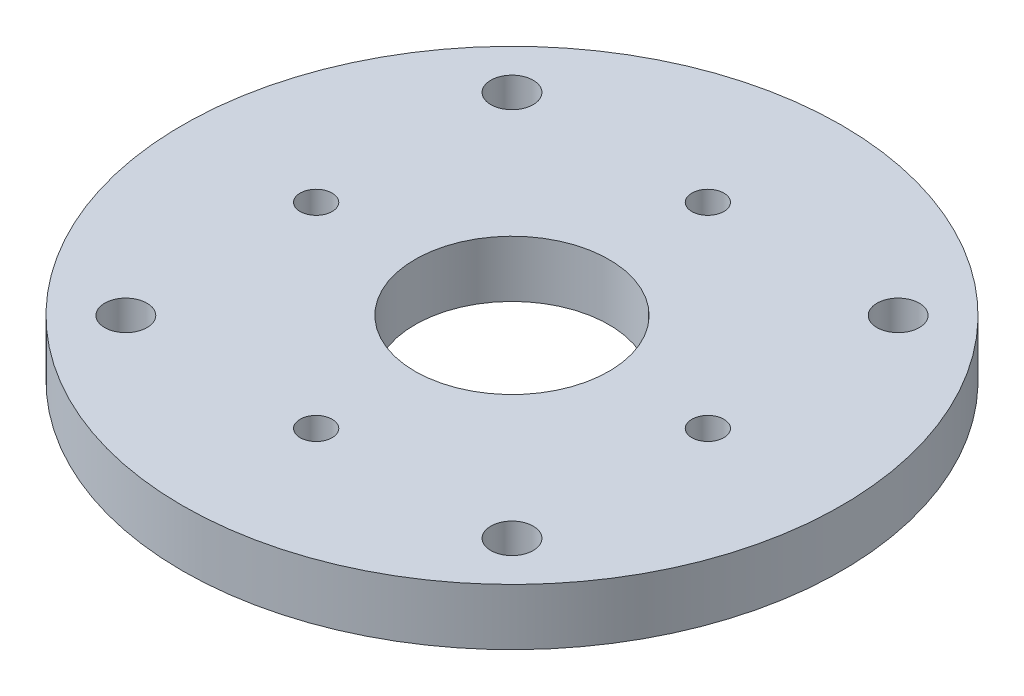
ISO-10303-21;
HEADER;
FILE_DESCRIPTION(('STEP AP214'),'2;1');
FILE_NAME('part.step','',(''),(''),'','','');
FILE_SCHEMA(('AUTOMOTIVE_DESIGN { 1 0 10303 214 1 1 1 1 }'));
ENDSEC;
DATA;
#1=APPLICATION_CONTEXT('core data for automotive mechanical design processes');
#2=APPLICATION_PROTOCOL_DEFINITION('international standard','automotive_design',2000,#1);
#3=PRODUCT_CONTEXT('',#1,'mechanical');
#4=PRODUCT('Part','Part','',(#3));
#5=PRODUCT_RELATED_PRODUCT_CATEGORY('part','',(#4));
#6=PRODUCT_DEFINITION_FORMATION('','',#4);
#7=PRODUCT_DEFINITION_CONTEXT('part definition',#1,'design');
#8=PRODUCT_DEFINITION('design','',#6,#7);
#9=PRODUCT_DEFINITION_SHAPE('','',#8);
#10=(LENGTH_UNIT() NAMED_UNIT(*) SI_UNIT(.MILLI.,.METRE.));
#11=(NAMED_UNIT(*) PLANE_ANGLE_UNIT() SI_UNIT($,.RADIAN.));
#12=(NAMED_UNIT(*) SI_UNIT($,.STERADIAN.) SOLID_ANGLE_UNIT());
#13=UNCERTAINTY_MEASURE_WITH_UNIT(LENGTH_MEASURE(1.E-05),#10,'distance_accuracy_value','');
#14=(GEOMETRIC_REPRESENTATION_CONTEXT(3) GLOBAL_UNCERTAINTY_ASSIGNED_CONTEXT((#13)) GLOBAL_UNIT_ASSIGNED_CONTEXT((#10,
#11,#12)) REPRESENTATION_CONTEXT('',''));
#15=CARTESIAN_POINT('',(0.,0.,0.));
#16=DIRECTION('',(0.,0.,1.));
#17=DIRECTION('',(1.,0.,0.));
#18=AXIS2_PLACEMENT_3D('',#15,#16,#17);
#19=CARTESIAN_POINT('',(0.,6.,0.));
#20=DIRECTION('',(0.,1.,0.));
#21=DIRECTION('',(0.,0.,1.));
#22=AXIS2_PLACEMENT_3D('',#19,#20,#21);
#23=PLANE('',#22);
#24=CARTESIAN_POINT('',(20.5060966544097,6.,20.5060966544101));
#25=DIRECTION('',(0.,1.,0.));
#26=DIRECTION('',(0.,0.,1.));
#27=AXIS2_PLACEMENT_3D('',#24,#25,#26);
#28=CIRCLE('',#27,2.25);
#29=CARTESIAN_POINT('',(20.5060966544097,6.,22.7560966544101));
#30=VERTEX_POINT('',#29);
#31=EDGE_CURVE('E91',#30,#30,#28,.T.);
#32=ORIENTED_EDGE('',*,*,#31,.F.);
#33=EDGE_LOOP('',(#32));
#34=FACE_BOUND('',#33,.T.);
#35=CARTESIAN_POINT('',(20.50609665441,6.,-20.5060966544097));
#36=DIRECTION('',(0.,1.,0.));
#37=DIRECTION('',(0.,0.,1.));
#38=AXIS2_PLACEMENT_3D('',#35,#36,#37);
#39=CIRCLE('',#38,2.25);
#40=CARTESIAN_POINT('',(20.50609665441,6.,-18.2560966544097));
#41=VERTEX_POINT('',#40);
#42=EDGE_CURVE('E97',#41,#41,#39,.T.);
#43=ORIENTED_EDGE('',*,*,#42,.F.);
#44=EDGE_LOOP('',(#43));
#45=FACE_BOUND('',#44,.T.);
#46=CARTESIAN_POINT('',(-20.5060966544098,6.,-20.50609665441));
#47=DIRECTION('',(0.,1.,0.));
#48=DIRECTION('',(0.,0.,1.));
#49=AXIS2_PLACEMENT_3D('',#46,#47,#48);
#50=CIRCLE('',#49,2.25);
#51=CARTESIAN_POINT('',(-20.5060966544098,6.,-18.25609665441));
#52=VERTEX_POINT('',#51);
#53=EDGE_CURVE('E85',#52,#52,#50,.T.);
#54=ORIENTED_EDGE('',*,*,#53,.F.);
#55=EDGE_LOOP('',(#54));
#56=FACE_BOUND('',#55,.T.);
#57=CARTESIAN_POINT('',(-20.5060966544099,6.,20.5060966544099));
#58=DIRECTION('',(0.,1.,0.));
#59=DIRECTION('',(0.,0.,1.));
#60=AXIS2_PLACEMENT_3D('',#57,#58,#59);
#61=CIRCLE('',#60,2.25);
#62=CARTESIAN_POINT('',(-20.5060966544099,6.,22.7560966544099));
#63=VERTEX_POINT('',#62);
#64=EDGE_CURVE('E82',#63,#63,#61,.T.);
#65=ORIENTED_EDGE('',*,*,#64,.F.);
#66=EDGE_LOOP('',(#65));
#67=FACE_BOUND('',#66,.T.);
#68=CARTESIAN_POINT('',(-20.8,6.,0.));
#69=DIRECTION('',(0.,1.,0.));
#70=DIRECTION('',(0.,0.,1.));
#71=AXIS2_PLACEMENT_3D('',#68,#69,#70);
#72=CIRCLE('',#71,1.7);
#73=CARTESIAN_POINT('',(-20.8,6.,1.7));
#74=VERTEX_POINT('',#73);
#75=EDGE_CURVE('E77',#74,#74,#72,.T.);
#76=ORIENTED_EDGE('',*,*,#75,.F.);
#77=EDGE_LOOP('',(#76));
#78=FACE_BOUND('',#77,.T.);
#79=CARTESIAN_POINT('',(0.,6.,-20.8));
#80=DIRECTION('',(0.,1.,0.));
#81=DIRECTION('',(0.,0.,1.));
#82=AXIS2_PLACEMENT_3D('',#79,#80,#81);
#83=CIRCLE('',#82,1.7);
#84=CARTESIAN_POINT('',(0.,6.,-19.1));
#85=VERTEX_POINT('',#84);
#86=EDGE_CURVE('E74',#85,#85,#83,.T.);
#87=ORIENTED_EDGE('',*,*,#86,.F.);
#88=EDGE_LOOP('',(#87));
#89=FACE_BOUND('',#88,.T.);
#90=CARTESIAN_POINT('',(20.8,6.,0.));
#91=DIRECTION('',(0.,1.,0.));
#92=DIRECTION('',(0.,0.,1.));
#93=AXIS2_PLACEMENT_3D('',#90,#91,#92);
#94=CIRCLE('',#93,1.7);
#95=CARTESIAN_POINT('',(20.8,6.,1.7));
#96=VERTEX_POINT('',#95);
#97=EDGE_CURVE('E68',#96,#96,#94,.T.);
#98=ORIENTED_EDGE('',*,*,#97,.F.);
#99=EDGE_LOOP('',(#98));
#100=FACE_BOUND('',#99,.T.);
#101=CARTESIAN_POINT('',(0.,6.,20.8));
#102=DIRECTION('',(0.,1.,0.));
#103=DIRECTION('',(0.,0.,1.));
#104=AXIS2_PLACEMENT_3D('',#101,#102,#103);
#105=CIRCLE('',#104,1.7);
#106=CARTESIAN_POINT('',(0.,6.,22.5));
#107=VERTEX_POINT('',#106);
#108=EDGE_CURVE('E61',#107,#107,#105,.T.);
#109=ORIENTED_EDGE('',*,*,#108,.F.);
#110=EDGE_LOOP('',(#109));
#111=FACE_BOUND('',#110,.T.);
#112=CARTESIAN_POINT('',(0.,6.,0.));
#113=DIRECTION('',(0.,1.,0.));
#114=DIRECTION('',(0.,0.,1.));
#115=AXIS2_PLACEMENT_3D('',#112,#113,#114);
#116=CIRCLE('',#115,35.);
#117=CARTESIAN_POINT('',(0.,6.,35.));
#118=VERTEX_POINT('',#117);
#119=EDGE_CURVE('E10',#118,#118,#116,.T.);
#120=ORIENTED_EDGE('',*,*,#119,.T.);
#121=EDGE_LOOP('',(#120));
#122=FACE_BOUND('',#121,.T.);
#123=CARTESIAN_POINT('',(0.,6.,0.));
#124=DIRECTION('',(0.,1.,0.));
#125=DIRECTION('',(0.,0.,1.));
#126=AXIS2_PLACEMENT_3D('',#123,#124,#125);
#127=CIRCLE('',#126,10.3);
#128=CARTESIAN_POINT('',(0.,6.,10.3));
#129=VERTEX_POINT('',#128);
#130=EDGE_CURVE('E50',#129,#129,#127,.T.);
#131=ORIENTED_EDGE('',*,*,#130,.F.);
#132=EDGE_LOOP('',(#131));
#133=FACE_BOUND('',#132,.T.);
#134=ADVANCED_FACE('F39',(#34,#45,#56,#67,#78,#89,#100,#111,#122,#133),#23,.T.);
#135=CARTESIAN_POINT('',(0.,0.,0.));
#136=DIRECTION('',(0.,1.,0.));
#137=DIRECTION('',(0.,0.,1.));
#138=AXIS2_PLACEMENT_3D('',#135,#136,#137);
#139=PLANE('',#138);
#140=CARTESIAN_POINT('',(20.5060966544097,0.,20.5060966544101));
#141=DIRECTION('',(0.,1.,0.));
#142=DIRECTION('',(0.,0.,1.));
#143=AXIS2_PLACEMENT_3D('',#140,#141,#142);
#144=CIRCLE('',#143,2.25);
#145=CARTESIAN_POINT('',(20.5060966544097,0.,22.7560966544101));
#146=VERTEX_POINT('',#145);
#147=EDGE_CURVE('E88',#146,#146,#144,.T.);
#148=ORIENTED_EDGE('',*,*,#147,.T.);
#149=EDGE_LOOP('',(#148));
#150=FACE_BOUND('',#149,.T.);
#151=CARTESIAN_POINT('',(20.50609665441,0.,-20.5060966544097));
#152=DIRECTION('',(0.,1.,0.));
#153=DIRECTION('',(0.,0.,1.));
#154=AXIS2_PLACEMENT_3D('',#151,#152,#153);
#155=CIRCLE('',#154,2.25);
#156=CARTESIAN_POINT('',(20.50609665441,0.,-18.2560966544097));
#157=VERTEX_POINT('',#156);
#158=EDGE_CURVE('E94',#157,#157,#155,.T.);
#159=ORIENTED_EDGE('',*,*,#158,.T.);
#160=EDGE_LOOP('',(#159));
#161=FACE_BOUND('',#160,.T.);
#162=CARTESIAN_POINT('',(-20.5060966544098,0.,-20.50609665441));
#163=DIRECTION('',(0.,1.,0.));
#164=DIRECTION('',(0.,0.,1.));
#165=AXIS2_PLACEMENT_3D('',#162,#163,#164);
#166=CIRCLE('',#165,2.25);
#167=CARTESIAN_POINT('',(-20.5060966544098,0.,-18.25609665441));
#168=VERTEX_POINT('',#167);
#169=EDGE_CURVE('E100',#168,#168,#166,.T.);
#170=ORIENTED_EDGE('',*,*,#169,.T.);
#171=EDGE_LOOP('',(#170));
#172=FACE_BOUND('',#171,.T.);
#173=CARTESIAN_POINT('',(-20.5060966544099,0.,20.5060966544099));
#174=DIRECTION('',(0.,1.,0.));
#175=DIRECTION('',(0.,0.,1.));
#176=AXIS2_PLACEMENT_3D('',#173,#174,#175);
#177=CIRCLE('',#176,2.25);
#178=CARTESIAN_POINT('',(-20.5060966544099,0.,22.7560966544099));
#179=VERTEX_POINT('',#178);
#180=EDGE_CURVE('E62',#179,#179,#177,.T.);
#181=ORIENTED_EDGE('',*,*,#180,.T.);
#182=EDGE_LOOP('',(#181));
#183=FACE_BOUND('',#182,.T.);
#184=CARTESIAN_POINT('',(-20.8,0.,0.));
#185=DIRECTION('',(0.,1.,0.));
#186=DIRECTION('',(0.,0.,1.));
#187=AXIS2_PLACEMENT_3D('',#184,#185,#186);
#188=CIRCLE('',#187,1.7);
#189=CARTESIAN_POINT('',(-20.8,0.,1.7));
#190=VERTEX_POINT('',#189);
#191=EDGE_CURVE('E55',#190,#190,#188,.T.);
#192=ORIENTED_EDGE('',*,*,#191,.T.);
#193=EDGE_LOOP('',(#192));
#194=FACE_BOUND('',#193,.T.);
#195=CARTESIAN_POINT('',(0.,0.,-20.8));
#196=DIRECTION('',(0.,1.,0.));
#197=DIRECTION('',(0.,0.,1.));
#198=AXIS2_PLACEMENT_3D('',#195,#196,#197);
#199=CIRCLE('',#198,1.7);
#200=CARTESIAN_POINT('',(0.,0.,-19.1));
#201=VERTEX_POINT('',#200);
#202=EDGE_CURVE('E71',#201,#201,#199,.T.);
#203=ORIENTED_EDGE('',*,*,#202,.T.);
#204=EDGE_LOOP('',(#203));
#205=FACE_BOUND('',#204,.T.);
#206=CARTESIAN_POINT('',(20.8,0.,0.));
#207=DIRECTION('',(0.,1.,0.));
#208=DIRECTION('',(0.,0.,1.));
#209=AXIS2_PLACEMENT_3D('',#206,#207,#208);
#210=CIRCLE('',#209,1.7);
#211=CARTESIAN_POINT('',(20.8,0.,1.7));
#212=VERTEX_POINT('',#211);
#213=EDGE_CURVE('E65',#212,#212,#210,.T.);
#214=ORIENTED_EDGE('',*,*,#213,.T.);
#215=EDGE_LOOP('',(#214));
#216=FACE_BOUND('',#215,.T.);
#217=CARTESIAN_POINT('',(0.,0.,20.8));
#218=DIRECTION('',(0.,1.,0.));
#219=DIRECTION('',(0.,0.,1.));
#220=AXIS2_PLACEMENT_3D('',#217,#218,#219);
#221=CIRCLE('',#220,1.7);
#222=CARTESIAN_POINT('',(0.,0.,22.5));
#223=VERTEX_POINT('',#222);
#224=EDGE_CURVE('E58',#223,#223,#221,.T.);
#225=ORIENTED_EDGE('',*,*,#224,.T.);
#226=EDGE_LOOP('',(#225));
#227=FACE_BOUND('',#226,.T.);
#228=CARTESIAN_POINT('',(0.,0.,0.));
#229=DIRECTION('',(0.,1.,0.));
#230=DIRECTION('',(0.,0.,1.));
#231=AXIS2_PLACEMENT_3D('',#228,#229,#230);
#232=CIRCLE('',#231,35.);
#233=CARTESIAN_POINT('',(0.,0.,35.));
#234=VERTEX_POINT('',#233);
#235=EDGE_CURVE('E43',#234,#234,#232,.T.);
#236=ORIENTED_EDGE('',*,*,#235,.F.);
#237=EDGE_LOOP('',(#236));
#238=FACE_BOUND('',#237,.T.);
#239=CARTESIAN_POINT('',(0.,0.,0.));
#240=DIRECTION('',(0.,1.,0.));
#241=DIRECTION('',(0.,0.,1.));
#242=AXIS2_PLACEMENT_3D('',#239,#240,#241);
#243=CIRCLE('',#242,10.3);
#244=CARTESIAN_POINT('',(0.,0.,10.3));
#245=VERTEX_POINT('',#244);
#246=EDGE_CURVE('E52',#245,#245,#243,.T.);
#247=ORIENTED_EDGE('',*,*,#246,.T.);
#248=EDGE_LOOP('',(#247));
#249=FACE_BOUND('',#248,.T.);
#250=ADVANCED_FACE('F110',(#150,#161,#172,#183,#194,#205,#216,#227,#238,#249),#139,.F.);
#251=CARTESIAN_POINT('',(0.,6.,0.));
#252=DIRECTION('',(0.,-1.,0.));
#253=DIRECTION('',(0.,0.,-1.));
#254=AXIS2_PLACEMENT_3D('',#251,#252,#253);
#255=CYLINDRICAL_SURFACE('',#254,35.);
#256=ORIENTED_EDGE('',*,*,#119,.F.);
#257=EDGE_LOOP('',(#256));
#258=FACE_BOUND('',#257,.T.);
#259=ORIENTED_EDGE('',*,*,#235,.T.);
#260=EDGE_LOOP('',(#259));
#261=FACE_BOUND('',#260,.T.);
#262=ADVANCED_FACE('F41',(#258,#261),#255,.T.);
#263=CARTESIAN_POINT('',(0.,6.,0.));
#264=DIRECTION('',(0.,-1.,0.));
#265=DIRECTION('',(0.,0.,-1.));
#266=AXIS2_PLACEMENT_3D('',#263,#264,#265);
#267=CYLINDRICAL_SURFACE('',#266,10.3);
#268=ORIENTED_EDGE('',*,*,#130,.T.);
#269=EDGE_LOOP('',(#268));
#270=FACE_BOUND('',#269,.T.);
#271=ORIENTED_EDGE('',*,*,#246,.F.);
#272=EDGE_LOOP('',(#271));
#273=FACE_BOUND('',#272,.T.);
#274=ADVANCED_FACE('F125',(#270,#273),#267,.F.);
#275=CARTESIAN_POINT('',(0.,0.,20.8));
#276=DIRECTION('',(0.,1.,0.));
#277=DIRECTION('',(0.,0.,1.));
#278=AXIS2_PLACEMENT_3D('',#275,#276,#277);
#279=CYLINDRICAL_SURFACE('',#278,1.7);
#280=ORIENTED_EDGE('',*,*,#224,.F.);
#281=EDGE_LOOP('',(#280));
#282=FACE_BOUND('',#281,.T.);
#283=ORIENTED_EDGE('',*,*,#108,.T.);
#284=EDGE_LOOP('',(#283));
#285=FACE_BOUND('',#284,.T.);
#286=ADVANCED_FACE('F128',(#282,#285),#279,.F.);
#287=CARTESIAN_POINT('',(20.8,0.,0.));
#288=DIRECTION('',(0.,1.,0.));
#289=DIRECTION('',(0.,0.,1.));
#290=AXIS2_PLACEMENT_3D('',#287,#288,#289);
#291=CYLINDRICAL_SURFACE('',#290,1.7);
#292=ORIENTED_EDGE('',*,*,#213,.F.);
#293=EDGE_LOOP('',(#292));
#294=FACE_BOUND('',#293,.T.);
#295=ORIENTED_EDGE('',*,*,#97,.T.);
#296=EDGE_LOOP('',(#295));
#297=FACE_BOUND('',#296,.T.);
#298=ADVANCED_FACE('F143',(#294,#297),#291,.F.);
#299=CARTESIAN_POINT('',(0.,0.,-20.8));
#300=DIRECTION('',(0.,1.,0.));
#301=DIRECTION('',(0.,0.,1.));
#302=AXIS2_PLACEMENT_3D('',#299,#300,#301);
#303=CYLINDRICAL_SURFACE('',#302,1.7);
#304=ORIENTED_EDGE('',*,*,#202,.F.);
#305=EDGE_LOOP('',(#304));
#306=FACE_BOUND('',#305,.T.);
#307=ORIENTED_EDGE('',*,*,#86,.T.);
#308=EDGE_LOOP('',(#307));
#309=FACE_BOUND('',#308,.T.);
#310=ADVANCED_FACE('F147',(#306,#309),#303,.F.);
#311=CARTESIAN_POINT('',(-20.8,0.,0.));
#312=DIRECTION('',(0.,1.,0.));
#313=DIRECTION('',(0.,0.,1.));
#314=AXIS2_PLACEMENT_3D('',#311,#312,#313);
#315=CYLINDRICAL_SURFACE('',#314,1.7);
#316=ORIENTED_EDGE('',*,*,#191,.F.);
#317=EDGE_LOOP('',(#316));
#318=FACE_BOUND('',#317,.T.);
#319=ORIENTED_EDGE('',*,*,#75,.T.);
#320=EDGE_LOOP('',(#319));
#321=FACE_BOUND('',#320,.T.);
#322=ADVANCED_FACE('F151',(#318,#321),#315,.F.);
#323=CARTESIAN_POINT('',(-20.5060966544099,0.,20.5060966544099));
#324=DIRECTION('',(0.,1.,0.));
#325=DIRECTION('',(0.,0.,1.));
#326=AXIS2_PLACEMENT_3D('',#323,#324,#325);
#327=CYLINDRICAL_SURFACE('',#326,2.25);
#328=ORIENTED_EDGE('',*,*,#180,.F.);
#329=EDGE_LOOP('',(#328));
#330=FACE_BOUND('',#329,.T.);
#331=ORIENTED_EDGE('',*,*,#64,.T.);
#332=EDGE_LOOP('',(#331));
#333=FACE_BOUND('',#332,.T.);
#334=ADVANCED_FACE('F155',(#330,#333),#327,.F.);
#335=CARTESIAN_POINT('',(-20.5060966544098,0.,-20.50609665441));
#336=DIRECTION('',(0.,1.,0.));
#337=DIRECTION('',(0.,0.,1.));
#338=AXIS2_PLACEMENT_3D('',#335,#336,#337);
#339=CYLINDRICAL_SURFACE('',#338,2.25);
#340=ORIENTED_EDGE('',*,*,#169,.F.);
#341=EDGE_LOOP('',(#340));
#342=FACE_BOUND('',#341,.T.);
#343=ORIENTED_EDGE('',*,*,#53,.T.);
#344=EDGE_LOOP('',(#343));
#345=FACE_BOUND('',#344,.T.);
#346=ADVANCED_FACE('F106',(#342,#345),#339,.F.);
#347=CARTESIAN_POINT('',(20.50609665441,0.,-20.5060966544097));
#348=DIRECTION('',(0.,1.,0.));
#349=DIRECTION('',(0.,0.,1.));
#350=AXIS2_PLACEMENT_3D('',#347,#348,#349);
#351=CYLINDRICAL_SURFACE('',#350,2.25);
#352=ORIENTED_EDGE('',*,*,#158,.F.);
#353=EDGE_LOOP('',(#352));
#354=FACE_BOUND('',#353,.T.);
#355=ORIENTED_EDGE('',*,*,#42,.T.);
#356=EDGE_LOOP('',(#355));
#357=FACE_BOUND('',#356,.T.);
#358=ADVANCED_FACE('F162',(#354,#357),#351,.F.);
#359=CARTESIAN_POINT('',(20.5060966544097,0.,20.5060966544101));
#360=DIRECTION('',(0.,1.,0.));
#361=DIRECTION('',(0.,0.,1.));
#362=AXIS2_PLACEMENT_3D('',#359,#360,#361);
#363=CYLINDRICAL_SURFACE('',#362,2.25);
#364=ORIENTED_EDGE('',*,*,#147,.F.);
#365=EDGE_LOOP('',(#364));
#366=FACE_BOUND('',#365,.T.);
#367=ORIENTED_EDGE('',*,*,#31,.T.);
#368=EDGE_LOOP('',(#367));
#369=FACE_BOUND('',#368,.T.);
#370=ADVANCED_FACE('F159',(#366,#369),#363,.F.);
#371=CLOSED_SHELL('',(#134,#250,#262,#274,#286,#298,#310,#322,#334,#346,#358,#370));
#372=MANIFOLD_SOLID_BREP('B2',#371);
#373=ADVANCED_BREP_SHAPE_REPRESENTATION('',(#18,#372),#14);
#374=SHAPE_DEFINITION_REPRESENTATION(#9,#373);
ENDSEC;
END-ISO-10303-21;
